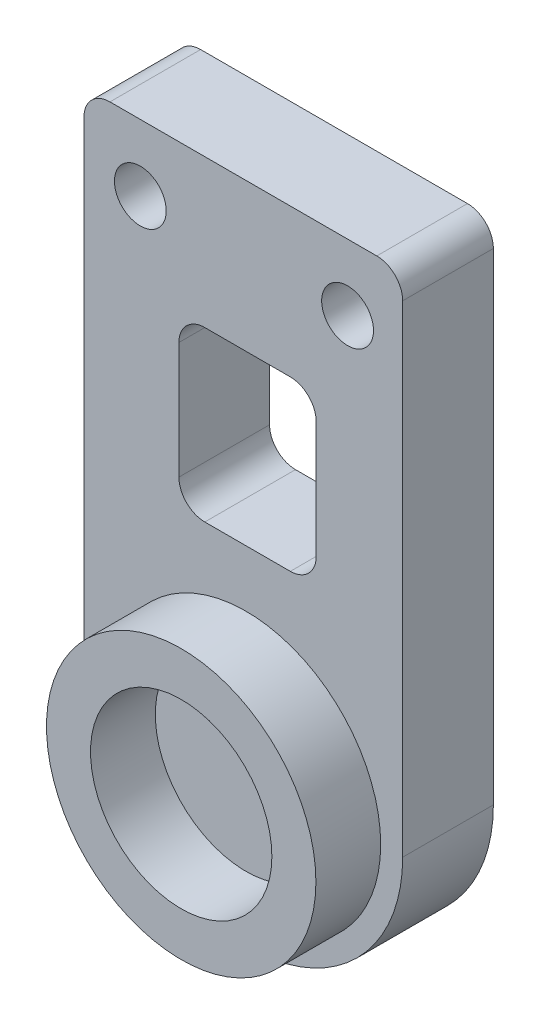
ISO-10303-21;
HEADER;
FILE_DESCRIPTION(('STEP AP214'),'2;1');
FILE_NAME('part.step','',(''),(''),'','','');
FILE_SCHEMA(('AUTOMOTIVE_DESIGN { 1 0 10303 214 1 1 1 1 }'));
ENDSEC;
DATA;
#1=APPLICATION_CONTEXT('core data for automotive mechanical design processes');
#2=APPLICATION_PROTOCOL_DEFINITION('international standard','automotive_design',2000,#1);
#3=PRODUCT_CONTEXT('',#1,'mechanical');
#4=PRODUCT('Part','Part','',(#3));
#5=PRODUCT_RELATED_PRODUCT_CATEGORY('part','',(#4));
#6=PRODUCT_DEFINITION_FORMATION('','',#4);
#7=PRODUCT_DEFINITION_CONTEXT('part definition',#1,'design');
#8=PRODUCT_DEFINITION('design','',#6,#7);
#9=PRODUCT_DEFINITION_SHAPE('','',#8);
#10=(LENGTH_UNIT() NAMED_UNIT(*) SI_UNIT(.MILLI.,.METRE.));
#11=(NAMED_UNIT(*) PLANE_ANGLE_UNIT() SI_UNIT($,.RADIAN.));
#12=(NAMED_UNIT(*) SI_UNIT($,.STERADIAN.) SOLID_ANGLE_UNIT());
#13=UNCERTAINTY_MEASURE_WITH_UNIT(LENGTH_MEASURE(1.E-05),#10,'distance_accuracy_value','');
#14=(GEOMETRIC_REPRESENTATION_CONTEXT(3) GLOBAL_UNCERTAINTY_ASSIGNED_CONTEXT((#13)) GLOBAL_UNIT_ASSIGNED_CONTEXT((#10,
#11,#12)) REPRESENTATION_CONTEXT('',''));
#15=CARTESIAN_POINT('',(0.,0.,0.));
#16=DIRECTION('',(0.,0.,1.));
#17=DIRECTION('',(1.,0.,0.));
#18=AXIS2_PLACEMENT_3D('',#15,#16,#17);
#19=CARTESIAN_POINT('',(-301.254618969033,240.505749953129,11.5));
#20=DIRECTION('',(1.,0.,0.));
#21=DIRECTION('',(0.,0.,-1.));
#22=AXIS2_PLACEMENT_3D('',#19,#20,#21);
#23=PLANE('',#22);
#24=DIRECTION('',(0.,-1.,0.));
#25=VECTOR('',#24,1.);
#26=CARTESIAN_POINT('',(-301.254618969033,240.505749953129,8.));
#27=LINE('',#26,#25);
#28=CARTESIAN_POINT('',(-301.254618969033,239.505749953129,8.));
#29=VERTEX_POINT('',#28);
#30=CARTESIAN_POINT('',(-301.254618969033,220.905749953129,8.));
#31=VERTEX_POINT('',#30);
#32=EDGE_CURVE('E214',#29,#31,#27,.T.);
#33=ORIENTED_EDGE('',*,*,#32,.T.);
#34=DIRECTION('',(0.,0.,-1.));
#35=VECTOR('',#34,1.);
#36=CARTESIAN_POINT('',(-301.254618969033,220.905749953129,11.5));
#37=LINE('',#36,#35);
#38=CARTESIAN_POINT('',(-301.254618969033,220.905749953129,11.5));
#39=VERTEX_POINT('',#38);
#40=EDGE_CURVE('E48',#31,#39,#37,.F.);
#41=ORIENTED_EDGE('',*,*,#40,.T.);
#42=DIRECTION('',(0.,-1.,0.));
#43=VECTOR('',#42,1.);
#44=CARTESIAN_POINT('',(-301.254618969033,240.505749953129,11.5));
#45=LINE('',#44,#43);
#46=CARTESIAN_POINT('',(-301.254618969033,239.505749953129,11.5));
#47=VERTEX_POINT('',#46);
#48=EDGE_CURVE('E200',#47,#39,#45,.T.);
#49=ORIENTED_EDGE('',*,*,#48,.F.);
#50=DIRECTION('',(0.,0.,-1.));
#51=VECTOR('',#50,1.);
#52=CARTESIAN_POINT('',(-301.254618969033,239.505749953129,11.5));
#53=LINE('',#52,#51);
#54=EDGE_CURVE('E248',#47,#29,#53,.T.);
#55=ORIENTED_EDGE('',*,*,#54,.T.);
#56=EDGE_LOOP('',(#33,#41,#49,#55));
#57=FACE_BOUND('',#56,.T.);
#58=ADVANCED_FACE('F39',(#57),#23,.F.);
#59=CARTESIAN_POINT('',(-301.254618969033,214.905749953129,11.5));
#60=DIRECTION('',(0.,1.,0.));
#61=DIRECTION('',(0.,0.,1.));
#62=AXIS2_PLACEMENT_3D('',#59,#60,#61);
#63=PLANE('',#62);
#64=DIRECTION('',(1.,0.,0.));
#65=VECTOR('',#64,1.);
#66=CARTESIAN_POINT('',(-301.254618969033,214.905749953129,8.));
#67=LINE('',#66,#65);
#68=CARTESIAN_POINT('',(-295.254618969033,214.905749953129,8.));
#69=VERTEX_POINT('',#68);
#70=CARTESIAN_POINT('',(-294.954618969033,214.905749953129,8.));
#71=VERTEX_POINT('',#70);
#72=EDGE_CURVE('E217',#69,#71,#67,.T.);
#73=ORIENTED_EDGE('',*,*,#72,.T.);
#74=DIRECTION('',(0.,0.,-1.));
#75=VECTOR('',#74,1.);
#76=CARTESIAN_POINT('',(-294.954618969033,214.905749953129,11.5));
#77=LINE('',#76,#75);
#78=CARTESIAN_POINT('',(-294.954618969033,214.905749953129,11.5));
#79=VERTEX_POINT('',#78);
#80=EDGE_CURVE('E62',#71,#79,#77,.F.);
#81=ORIENTED_EDGE('',*,*,#80,.T.);
#82=DIRECTION('',(1.,0.,0.));
#83=VECTOR('',#82,1.);
#84=CARTESIAN_POINT('',(-301.254618969033,214.905749953129,11.5));
#85=LINE('',#84,#83);
#86=CARTESIAN_POINT('',(-295.254618969033,214.905749953129,11.5));
#87=VERTEX_POINT('',#86);
#88=EDGE_CURVE('E203',#87,#79,#85,.T.);
#89=ORIENTED_EDGE('',*,*,#88,.F.);
#90=DIRECTION('',(0.,0.,-1.));
#91=VECTOR('',#90,1.);
#92=CARTESIAN_POINT('',(-295.254618969033,214.905749953129,11.5));
#93=LINE('',#92,#91);
#94=EDGE_CURVE('E304',#87,#69,#93,.T.);
#95=ORIENTED_EDGE('',*,*,#94,.T.);
#96=EDGE_LOOP('',(#73,#81,#89,#95));
#97=FACE_BOUND('',#96,.T.);
#98=ADVANCED_FACE('F384',(#97),#63,.F.);
#99=CARTESIAN_POINT('',(-288.954618969033,240.505749953129,11.5));
#100=DIRECTION('',(-1.,0.,0.));
#101=DIRECTION('',(0.,-1.,0.));
#102=AXIS2_PLACEMENT_3D('',#99,#100,#101);
#103=PLANE('',#102);
#104=DIRECTION('',(0.,1.,0.));
#105=VECTOR('',#104,1.);
#106=CARTESIAN_POINT('',(-288.954618969033,240.505749953129,11.5));
#107=LINE('',#106,#105);
#108=CARTESIAN_POINT('',(-288.954618969033,220.905749953129,11.5));
#109=VERTEX_POINT('',#108);
#110=CARTESIAN_POINT('',(-288.954618969033,239.505749953129,11.5));
#111=VERTEX_POINT('',#110);
#112=EDGE_CURVE('E207',#109,#111,#107,.T.);
#113=ORIENTED_EDGE('',*,*,#112,.F.);
#114=DIRECTION('',(0.,0.,-1.));
#115=VECTOR('',#114,1.);
#116=CARTESIAN_POINT('',(-288.954618969033,220.905749953129,11.5));
#117=LINE('',#116,#115);
#118=CARTESIAN_POINT('',(-288.954618969033,220.905749953129,8.));
#119=VERTEX_POINT('',#118);
#120=EDGE_CURVE('E294',#109,#119,#117,.T.);
#121=ORIENTED_EDGE('',*,*,#120,.T.);
#122=DIRECTION('',(0.,1.,0.));
#123=VECTOR('',#122,1.);
#124=CARTESIAN_POINT('',(-288.954618969033,240.505749953129,8.));
#125=LINE('',#124,#123);
#126=CARTESIAN_POINT('',(-288.954618969033,239.505749953129,8.));
#127=VERTEX_POINT('',#126);
#128=EDGE_CURVE('E221',#119,#127,#125,.T.);
#129=ORIENTED_EDGE('',*,*,#128,.T.);
#130=DIRECTION('',(0.,0.,-1.));
#131=VECTOR('',#130,1.);
#132=CARTESIAN_POINT('',(-288.954618969033,239.505749953129,11.5));
#133=LINE('',#132,#131);
#134=EDGE_CURVE('E168',#127,#111,#133,.F.);
#135=ORIENTED_EDGE('',*,*,#134,.T.);
#136=EDGE_LOOP('',(#113,#121,#129,#135));
#137=FACE_BOUND('',#136,.T.);
#138=ADVANCED_FACE('F389',(#137),#103,.F.);
#139=CARTESIAN_POINT('',(-301.254618969033,240.505749953129,11.5));
#140=DIRECTION('',(0.,-1.,0.));
#141=DIRECTION('',(0.,0.,-1.));
#142=AXIS2_PLACEMENT_3D('',#139,#140,#141);
#143=PLANE('',#142);
#144=DIRECTION('',(-1.,0.,0.));
#145=VECTOR('',#144,1.);
#146=CARTESIAN_POINT('',(-301.254618969033,240.505749953129,8.));
#147=LINE('',#146,#145);
#148=CARTESIAN_POINT('',(-289.954618969033,240.505749953129,8.));
#149=VERTEX_POINT('',#148);
#150=CARTESIAN_POINT('',(-300.254618969033,240.505749953129,8.));
#151=VERTEX_POINT('',#150);
#152=EDGE_CURVE('E204',#149,#151,#147,.T.);
#153=ORIENTED_EDGE('',*,*,#152,.T.);
#154=DIRECTION('',(0.,0.,-1.));
#155=VECTOR('',#154,1.);
#156=CARTESIAN_POINT('',(-300.254618969033,240.505749953129,11.5));
#157=LINE('',#156,#155);
#158=CARTESIAN_POINT('',(-300.254618969033,240.505749953129,11.5));
#159=VERTEX_POINT('',#158);
#160=EDGE_CURVE('E263',#151,#159,#157,.F.);
#161=ORIENTED_EDGE('',*,*,#160,.T.);
#162=DIRECTION('',(-1.,0.,0.));
#163=VECTOR('',#162,1.);
#164=CARTESIAN_POINT('',(-301.254618969033,240.505749953129,11.5));
#165=LINE('',#164,#163);
#166=CARTESIAN_POINT('',(-289.954618969033,240.505749953129,11.5));
#167=VERTEX_POINT('',#166);
#168=EDGE_CURVE('E210',#167,#159,#165,.T.);
#169=ORIENTED_EDGE('',*,*,#168,.F.);
#170=DIRECTION('',(0.,0.,-1.));
#171=VECTOR('',#170,1.);
#172=CARTESIAN_POINT('',(-289.954618969033,240.505749953129,11.5));
#173=LINE('',#172,#171);
#174=EDGE_CURVE('E259',#167,#149,#173,.T.);
#175=ORIENTED_EDGE('',*,*,#174,.T.);
#176=EDGE_LOOP('',(#153,#161,#169,#175));
#177=FACE_BOUND('',#176,.T.);
#178=ADVANCED_FACE('F430',(#177),#143,.F.);
#179=CARTESIAN_POINT('',(0.,0.,11.5));
#180=DIRECTION('',(0.,0.,1.));
#181=DIRECTION('',(1.,0.,0.));
#182=AXIS2_PLACEMENT_3D('',#179,#180,#181);
#183=PLANE('',#182);
#184=CARTESIAN_POINT('',(-295.004474020561,220.905749953129,11.5));
#185=DIRECTION('',(0.,0.,1.));
#186=DIRECTION('',(1.,0.,0.));
#187=AXIS2_PLACEMENT_3D('',#184,#185,#186);
#188=CIRCLE('',#187,5.19999999999997);
#189=CARTESIAN_POINT('',(-289.804474020561,220.905749953129,11.5));
#190=VERTEX_POINT('',#189);
#191=EDGE_CURVE('E354',#190,#190,#188,.T.);
#192=ORIENTED_EDGE('',*,*,#191,.F.);
#193=EDGE_LOOP('',(#192));
#194=FACE_BOUND('',#193,.T.);
#195=CARTESIAN_POINT('',(-299.082028178935,237.944260963885,11.5));
#196=DIRECTION('',(0.,0.,1.));
#197=DIRECTION('',(1.,0.,0.));
#198=AXIS2_PLACEMENT_3D('',#195,#196,#197);
#199=CIRCLE('',#198,0.999999999999998);
#200=CARTESIAN_POINT('',(-298.082028178935,237.944260963885,11.5));
#201=VERTEX_POINT('',#200);
#202=EDGE_CURVE('E319',#201,#201,#199,.T.);
#203=ORIENTED_EDGE('',*,*,#202,.F.);
#204=EDGE_LOOP('',(#203));
#205=FACE_BOUND('',#204,.T.);
#206=CARTESIAN_POINT('',(-291.082028178935,237.944260963885,11.5));
#207=DIRECTION('',(0.,0.,1.));
#208=DIRECTION('',(1.,0.,0.));
#209=AXIS2_PLACEMENT_3D('',#206,#207,#208);
#210=CIRCLE('',#209,0.999999999999998);
#211=CARTESIAN_POINT('',(-290.082028178935,237.944260963885,11.5));
#212=VERTEX_POINT('',#211);
#213=EDGE_CURVE('E327',#212,#212,#210,.T.);
#214=ORIENTED_EDGE('',*,*,#213,.F.);
#215=EDGE_LOOP('',(#214));
#216=FACE_BOUND('',#215,.T.);
#217=DIRECTION('',(0.,-1.,0.));
#218=VECTOR('',#217,1.);
#219=CARTESIAN_POINT('',(-297.592907714844,234.792892456055,11.5));
#220=LINE('',#219,#218);
#221=CARTESIAN_POINT('',(-297.592907714844,233.792892456055,11.5));
#222=VERTEX_POINT('',#221);
#223=CARTESIAN_POINT('',(-297.592907714844,229.292892456055,11.5));
#224=VERTEX_POINT('',#223);
#225=EDGE_CURVE('E196',#222,#224,#220,.T.);
#226=ORIENTED_EDGE('',*,*,#225,.F.);
#227=CARTESIAN_POINT('',(-296.592907714844,233.792892456055,11.5));
#228=DIRECTION('',(0.,0.,1.));
#229=DIRECTION('',(1.,0.,0.));
#230=AXIS2_PLACEMENT_3D('',#227,#228,#229);
#231=CIRCLE('',#230,1.);
#232=CARTESIAN_POINT('',(-296.592907714844,234.792892456055,11.5));
#233=VERTEX_POINT('',#232);
#234=EDGE_CURVE('E283',#222,#233,#231,.F.);
#235=ORIENTED_EDGE('',*,*,#234,.T.);
#236=DIRECTION('',(-1.,0.,0.));
#237=VECTOR('',#236,1.);
#238=CARTESIAN_POINT('',(-297.592907714844,234.792892456055,11.5));
#239=LINE('',#238,#237);
#240=CARTESIAN_POINT('',(-293.292907714844,234.792892456055,11.5));
#241=VERTEX_POINT('',#240);
#242=EDGE_CURVE('E188',#241,#233,#239,.T.);
#243=ORIENTED_EDGE('',*,*,#242,.F.);
#244=CARTESIAN_POINT('',(-293.292907714844,233.792892456055,11.5));
#245=DIRECTION('',(0.,0.,1.));
#246=DIRECTION('',(1.,0.,0.));
#247=AXIS2_PLACEMENT_3D('',#244,#245,#246);
#248=CIRCLE('',#247,1.);
#249=CARTESIAN_POINT('',(-292.292907714844,233.792892456055,11.5));
#250=VERTEX_POINT('',#249);
#251=EDGE_CURVE('E186',#241,#250,#248,.F.);
#252=ORIENTED_EDGE('',*,*,#251,.T.);
#253=DIRECTION('',(0.,1.,0.));
#254=VECTOR('',#253,1.);
#255=CARTESIAN_POINT('',(-292.292907714844,234.792892456055,11.5));
#256=LINE('',#255,#254);
#257=CARTESIAN_POINT('',(-292.292907714844,229.292892456055,11.5));
#258=VERTEX_POINT('',#257);
#259=EDGE_CURVE('E174',#258,#250,#256,.T.);
#260=ORIENTED_EDGE('',*,*,#259,.F.);
#261=CARTESIAN_POINT('',(-293.292907714844,229.292892456055,11.5));
#262=DIRECTION('',(0.,0.,1.));
#263=DIRECTION('',(1.,0.,0.));
#264=AXIS2_PLACEMENT_3D('',#261,#262,#263);
#265=CIRCLE('',#264,1.);
#266=CARTESIAN_POINT('',(-293.292907714844,228.292892456055,11.5));
#267=VERTEX_POINT('',#266);
#268=EDGE_CURVE('E156',#258,#267,#265,.F.);
#269=ORIENTED_EDGE('',*,*,#268,.T.);
#270=DIRECTION('',(1.,0.,0.));
#271=VECTOR('',#270,1.);
#272=CARTESIAN_POINT('',(-297.592907714844,228.292892456055,11.5));
#273=LINE('',#272,#271);
#274=CARTESIAN_POINT('',(-296.592907714844,228.292892456055,11.5));
#275=VERTEX_POINT('',#274);
#276=EDGE_CURVE('E189',#275,#267,#273,.T.);
#277=ORIENTED_EDGE('',*,*,#276,.F.);
#278=CARTESIAN_POINT('',(-296.592907714844,229.292892456055,11.5));
#279=DIRECTION('',(0.,0.,1.));
#280=DIRECTION('',(1.,0.,0.));
#281=AXIS2_PLACEMENT_3D('',#278,#279,#280);
#282=CIRCLE('',#281,1.);
#283=EDGE_CURVE('E277',#275,#224,#282,.F.);
#284=ORIENTED_EDGE('',*,*,#283,.T.);
#285=EDGE_LOOP('',(#226,#235,#243,#252,#260,#269,#277,#284));
#286=FACE_BOUND('',#285,.T.);
#287=ORIENTED_EDGE('',*,*,#88,.T.);
#288=CARTESIAN_POINT('',(-294.954618969033,220.905749953129,11.5));
#289=DIRECTION('',(0.,0.,1.));
#290=DIRECTION('',(1.,0.,0.));
#291=AXIS2_PLACEMENT_3D('',#288,#289,#290);
#292=CIRCLE('',#291,6.);
#293=EDGE_CURVE('E313',#79,#109,#292,.T.);
#294=ORIENTED_EDGE('',*,*,#293,.T.);
#295=ORIENTED_EDGE('',*,*,#112,.T.);
#296=CARTESIAN_POINT('',(-289.954618969033,239.505749953129,11.5));
#297=DIRECTION('',(0.,0.,1.));
#298=DIRECTION('',(1.,0.,0.));
#299=AXIS2_PLACEMENT_3D('',#296,#297,#298);
#300=CIRCLE('',#299,1.);
#301=EDGE_CURVE('E266',#111,#167,#300,.T.);
#302=ORIENTED_EDGE('',*,*,#301,.T.);
#303=ORIENTED_EDGE('',*,*,#168,.T.);
#304=CARTESIAN_POINT('',(-300.254618969033,239.505749953129,11.5));
#305=DIRECTION('',(0.,0.,1.));
#306=DIRECTION('',(1.,0.,0.));
#307=AXIS2_PLACEMENT_3D('',#304,#305,#306);
#308=CIRCLE('',#307,1.);
#309=EDGE_CURVE('E269',#159,#47,#308,.T.);
#310=ORIENTED_EDGE('',*,*,#309,.T.);
#311=ORIENTED_EDGE('',*,*,#48,.T.);
#312=CARTESIAN_POINT('',(-295.254618969033,220.905749953129,11.5));
#313=DIRECTION('',(0.,0.,1.));
#314=DIRECTION('',(1.,0.,0.));
#315=AXIS2_PLACEMENT_3D('',#312,#313,#314);
#316=CIRCLE('',#315,6.);
#317=EDGE_CURVE('E310',#39,#87,#316,.T.);
#318=ORIENTED_EDGE('',*,*,#317,.T.);
#319=EDGE_LOOP('',(#287,#294,#295,#302,#303,#310,#311,#318));
#320=FACE_BOUND('',#319,.T.);
#321=ADVANCED_FACE('F183',(#194,#205,#216,#286,#320),#183,.T.);
#322=CARTESIAN_POINT('',(0.,0.,8.));
#323=DIRECTION('',(0.,0.,1.));
#324=DIRECTION('',(1.,0.,0.));
#325=AXIS2_PLACEMENT_3D('',#322,#323,#324);
#326=PLANE('',#325);
#327=CARTESIAN_POINT('',(-299.082028178935,237.944260963885,8.));
#328=DIRECTION('',(0.,0.,1.));
#329=DIRECTION('',(1.,0.,0.));
#330=AXIS2_PLACEMENT_3D('',#327,#328,#329);
#331=CIRCLE('',#330,0.999999999999998);
#332=CARTESIAN_POINT('',(-298.082028178935,237.944260963885,8.));
#333=VERTEX_POINT('',#332);
#334=EDGE_CURVE('E218',#333,#333,#331,.T.);
#335=ORIENTED_EDGE('',*,*,#334,.T.);
#336=EDGE_LOOP('',(#335));
#337=FACE_BOUND('',#336,.T.);
#338=CARTESIAN_POINT('',(-291.082028178935,237.944260963885,8.));
#339=DIRECTION('',(0.,0.,1.));
#340=DIRECTION('',(1.,0.,0.));
#341=AXIS2_PLACEMENT_3D('',#338,#339,#340);
#342=CIRCLE('',#341,0.999999999999998);
#343=CARTESIAN_POINT('',(-290.082028178935,237.944260963885,8.));
#344=VERTEX_POINT('',#343);
#345=EDGE_CURVE('E323',#344,#344,#342,.T.);
#346=ORIENTED_EDGE('',*,*,#345,.T.);
#347=EDGE_LOOP('',(#346));
#348=FACE_BOUND('',#347,.T.);
#349=DIRECTION('',(0.,1.,0.));
#350=VECTOR('',#349,1.);
#351=CARTESIAN_POINT('',(-292.292907714844,234.792892456055,8.));
#352=LINE('',#351,#350);
#353=CARTESIAN_POINT('',(-292.292907714844,229.292892456055,8.));
#354=VERTEX_POINT('',#353);
#355=CARTESIAN_POINT('',(-292.292907714844,233.792892456055,8.));
#356=VERTEX_POINT('',#355);
#357=EDGE_CURVE('E177',#354,#356,#352,.T.);
#358=ORIENTED_EDGE('',*,*,#357,.T.);
#359=CARTESIAN_POINT('',(-293.292907714844,233.792892456055,8.));
#360=DIRECTION('',(0.,0.,1.));
#361=DIRECTION('',(1.,0.,0.));
#362=AXIS2_PLACEMENT_3D('',#359,#360,#361);
#363=CIRCLE('',#362,1.);
#364=CARTESIAN_POINT('',(-293.292907714844,234.792892456055,8.));
#365=VERTEX_POINT('',#364);
#366=EDGE_CURVE('E291',#356,#365,#363,.T.);
#367=ORIENTED_EDGE('',*,*,#366,.T.);
#368=DIRECTION('',(-1.,0.,0.));
#369=VECTOR('',#368,1.);
#370=CARTESIAN_POINT('',(-297.592907714844,234.792892456055,8.));
#371=LINE('',#370,#369);
#372=CARTESIAN_POINT('',(-296.592907714844,234.792892456055,8.));
#373=VERTEX_POINT('',#372);
#374=EDGE_CURVE('E331',#365,#373,#371,.T.);
#375=ORIENTED_EDGE('',*,*,#374,.T.);
#376=CARTESIAN_POINT('',(-296.592907714844,233.792892456055,8.));
#377=DIRECTION('',(0.,0.,1.));
#378=DIRECTION('',(1.,0.,0.));
#379=AXIS2_PLACEMENT_3D('',#376,#377,#378);
#380=CIRCLE('',#379,1.);
#381=CARTESIAN_POINT('',(-297.592907714844,233.792892456055,8.));
#382=VERTEX_POINT('',#381);
#383=EDGE_CURVE('E286',#373,#382,#380,.T.);
#384=ORIENTED_EDGE('',*,*,#383,.T.);
#385=DIRECTION('',(0.,-1.,0.));
#386=VECTOR('',#385,1.);
#387=CARTESIAN_POINT('',(-297.592907714844,234.792892456055,8.));
#388=LINE('',#387,#386);
#389=CARTESIAN_POINT('',(-297.592907714844,229.292892456055,8.));
#390=VERTEX_POINT('',#389);
#391=EDGE_CURVE('E194',#382,#390,#388,.T.);
#392=ORIENTED_EDGE('',*,*,#391,.T.);
#393=CARTESIAN_POINT('',(-296.592907714844,229.292892456055,8.));
#394=DIRECTION('',(0.,0.,1.));
#395=DIRECTION('',(1.,0.,0.));
#396=AXIS2_PLACEMENT_3D('',#393,#394,#395);
#397=CIRCLE('',#396,1.);
#398=CARTESIAN_POINT('',(-296.592907714844,228.292892456055,8.));
#399=VERTEX_POINT('',#398);
#400=EDGE_CURVE('E280',#390,#399,#397,.T.);
#401=ORIENTED_EDGE('',*,*,#400,.T.);
#402=DIRECTION('',(1.,0.,0.));
#403=VECTOR('',#402,1.);
#404=CARTESIAN_POINT('',(-297.592907714844,228.292892456055,8.));
#405=LINE('',#404,#403);
#406=CARTESIAN_POINT('',(-293.292907714844,228.292892456055,8.));
#407=VERTEX_POINT('',#406);
#408=EDGE_CURVE('E337',#399,#407,#405,.T.);
#409=ORIENTED_EDGE('',*,*,#408,.T.);
#410=CARTESIAN_POINT('',(-293.292907714844,229.292892456055,8.));
#411=DIRECTION('',(0.,0.,1.));
#412=DIRECTION('',(1.,0.,0.));
#413=AXIS2_PLACEMENT_3D('',#410,#411,#412);
#414=CIRCLE('',#413,1.);
#415=EDGE_CURVE('E167',#407,#354,#414,.T.);
#416=ORIENTED_EDGE('',*,*,#415,.T.);
#417=EDGE_LOOP('',(#358,#367,#375,#384,#392,#401,#409,#416));
#418=FACE_BOUND('',#417,.T.);
#419=ORIENTED_EDGE('',*,*,#128,.F.);
#420=CARTESIAN_POINT('',(-294.954618969033,220.905749953129,8.));
#421=DIRECTION('',(0.,0.,1.));
#422=DIRECTION('',(1.,0.,0.));
#423=AXIS2_PLACEMENT_3D('',#420,#421,#422);
#424=CIRCLE('',#423,6.);
#425=EDGE_CURVE('E301',#119,#71,#424,.F.);
#426=ORIENTED_EDGE('',*,*,#425,.T.);
#427=ORIENTED_EDGE('',*,*,#72,.F.);
#428=CARTESIAN_POINT('',(-295.254618969033,220.905749953129,8.));
#429=DIRECTION('',(0.,0.,1.));
#430=DIRECTION('',(1.,0.,0.));
#431=AXIS2_PLACEMENT_3D('',#428,#429,#430);
#432=CIRCLE('',#431,6.);
#433=EDGE_CURVE('E298',#69,#31,#432,.F.);
#434=ORIENTED_EDGE('',*,*,#433,.T.);
#435=ORIENTED_EDGE('',*,*,#32,.F.);
#436=CARTESIAN_POINT('',(-300.254618969033,239.505749953129,8.));
#437=DIRECTION('',(0.,0.,1.));
#438=DIRECTION('',(1.,0.,0.));
#439=AXIS2_PLACEMENT_3D('',#436,#437,#438);
#440=CIRCLE('',#439,1.);
#441=EDGE_CURVE('E256',#29,#151,#440,.F.);
#442=ORIENTED_EDGE('',*,*,#441,.T.);
#443=ORIENTED_EDGE('',*,*,#152,.F.);
#444=CARTESIAN_POINT('',(-289.954618969033,239.505749953129,8.));
#445=DIRECTION('',(0.,0.,1.));
#446=DIRECTION('',(1.,0.,0.));
#447=AXIS2_PLACEMENT_3D('',#444,#445,#446);
#448=CIRCLE('',#447,1.);
#449=EDGE_CURVE('E252',#149,#127,#448,.F.);
#450=ORIENTED_EDGE('',*,*,#449,.T.);
#451=EDGE_LOOP('',(#419,#426,#427,#434,#435,#442,#443,#450));
#452=FACE_BOUND('',#451,.T.);
#453=ADVANCED_FACE('F437',(#337,#348,#418,#452),#326,.F.);
#454=CARTESIAN_POINT('',(-297.592907714844,234.792892456055,8.));
#455=DIRECTION('',(-1.,0.,0.));
#456=DIRECTION('',(0.,0.,1.));
#457=AXIS2_PLACEMENT_3D('',#454,#455,#456);
#458=PLANE('',#457);
#459=ORIENTED_EDGE('',*,*,#225,.T.);
#460=DIRECTION('',(0.,0.,1.));
#461=VECTOR('',#460,1.);
#462=CARTESIAN_POINT('',(-297.592907714844,229.292892456055,8.));
#463=LINE('',#462,#461);
#464=EDGE_CURVE('E238',#224,#390,#463,.F.);
#465=ORIENTED_EDGE('',*,*,#464,.T.);
#466=ORIENTED_EDGE('',*,*,#391,.F.);
#467=DIRECTION('',(0.,0.,1.));
#468=VECTOR('',#467,1.);
#469=CARTESIAN_POINT('',(-297.592907714844,233.792892456055,11.5));
#470=LINE('',#469,#468);
#471=EDGE_CURVE('E234',#382,#222,#470,.T.);
#472=ORIENTED_EDGE('',*,*,#471,.T.);
#473=EDGE_LOOP('',(#459,#465,#466,#472));
#474=FACE_BOUND('',#473,.T.);
#475=ADVANCED_FACE('F441',(#474),#458,.F.);
#476=CARTESIAN_POINT('',(-297.592907714844,234.792892456055,8.));
#477=DIRECTION('',(0.,1.,0.));
#478=DIRECTION('',(0.,0.,1.));
#479=AXIS2_PLACEMENT_3D('',#476,#477,#478);
#480=PLANE('',#479);
#481=ORIENTED_EDGE('',*,*,#242,.T.);
#482=DIRECTION('',(0.,0.,1.));
#483=VECTOR('',#482,1.);
#484=CARTESIAN_POINT('',(-296.592907714844,234.792892456055,8.));
#485=LINE('',#484,#483);
#486=EDGE_CURVE('E245',#233,#373,#485,.F.);
#487=ORIENTED_EDGE('',*,*,#486,.T.);
#488=ORIENTED_EDGE('',*,*,#374,.F.);
#489=DIRECTION('',(0.,0.,1.));
#490=VECTOR('',#489,1.);
#491=CARTESIAN_POINT('',(-293.292907714844,234.792892456055,11.5));
#492=LINE('',#491,#490);
#493=EDGE_CURVE('E241',#365,#241,#492,.T.);
#494=ORIENTED_EDGE('',*,*,#493,.T.);
#495=EDGE_LOOP('',(#481,#487,#488,#494));
#496=FACE_BOUND('',#495,.T.);
#497=ADVANCED_FACE('F448',(#496),#480,.F.);
#498=CARTESIAN_POINT('',(-292.292907714844,234.792892456055,8.));
#499=DIRECTION('',(1.,0.,0.));
#500=DIRECTION('',(0.,0.,-1.));
#501=AXIS2_PLACEMENT_3D('',#498,#499,#500);
#502=PLANE('',#501);
#503=ORIENTED_EDGE('',*,*,#357,.F.);
#504=DIRECTION('',(0.,0.,1.));
#505=VECTOR('',#504,1.);
#506=CARTESIAN_POINT('',(-292.292907714844,229.292892456055,11.5));
#507=LINE('',#506,#505);
#508=EDGE_CURVE('E160',#354,#258,#507,.T.);
#509=ORIENTED_EDGE('',*,*,#508,.T.);
#510=ORIENTED_EDGE('',*,*,#259,.T.);
#511=DIRECTION('',(0.,0.,1.));
#512=VECTOR('',#511,1.);
#513=CARTESIAN_POINT('',(-292.292907714844,233.792892456055,8.));
#514=LINE('',#513,#512);
#515=EDGE_CURVE('E180',#250,#356,#514,.F.);
#516=ORIENTED_EDGE('',*,*,#515,.T.);
#517=EDGE_LOOP('',(#503,#509,#510,#516));
#518=FACE_BOUND('',#517,.T.);
#519=ADVANCED_FACE('F173',(#518),#502,.F.);
#520=CARTESIAN_POINT('',(-297.592907714844,228.292892456055,8.));
#521=DIRECTION('',(0.,-1.,0.));
#522=DIRECTION('',(0.,0.,-1.));
#523=AXIS2_PLACEMENT_3D('',#520,#521,#522);
#524=PLANE('',#523);
#525=ORIENTED_EDGE('',*,*,#276,.T.);
#526=DIRECTION('',(0.,0.,1.));
#527=VECTOR('',#526,1.);
#528=CARTESIAN_POINT('',(-293.292907714844,228.292892456055,8.));
#529=LINE('',#528,#527);
#530=EDGE_CURVE('E161',#267,#407,#529,.F.);
#531=ORIENTED_EDGE('',*,*,#530,.T.);
#532=ORIENTED_EDGE('',*,*,#408,.F.);
#533=DIRECTION('',(0.,0.,1.));
#534=VECTOR('',#533,1.);
#535=CARTESIAN_POINT('',(-296.592907714844,228.292892456055,11.5));
#536=LINE('',#535,#534);
#537=EDGE_CURVE('E179',#399,#275,#536,.T.);
#538=ORIENTED_EDGE('',*,*,#537,.T.);
#539=EDGE_LOOP('',(#525,#531,#532,#538));
#540=FACE_BOUND('',#539,.T.);
#541=ADVANCED_FACE('F555',(#540),#524,.F.);
#542=CARTESIAN_POINT('',(-291.082028178935,237.944260963885,8.));
#543=DIRECTION('',(0.,0.,1.));
#544=DIRECTION('',(1.,0.,0.));
#545=AXIS2_PLACEMENT_3D('',#542,#543,#544);
#546=CYLINDRICAL_SURFACE('',#545,0.999999999999998);
#547=ORIENTED_EDGE('',*,*,#345,.F.);
#548=EDGE_LOOP('',(#547));
#549=FACE_BOUND('',#548,.T.);
#550=ORIENTED_EDGE('',*,*,#213,.T.);
#551=EDGE_LOOP('',(#550));
#552=FACE_BOUND('',#551,.T.);
#553=ADVANCED_FACE('F546',(#549,#552),#546,.F.);
#554=CARTESIAN_POINT('',(-299.082028178935,237.944260963885,8.));
#555=DIRECTION('',(0.,0.,1.));
#556=DIRECTION('',(1.,0.,0.));
#557=AXIS2_PLACEMENT_3D('',#554,#555,#556);
#558=CYLINDRICAL_SURFACE('',#557,0.999999999999998);
#559=ORIENTED_EDGE('',*,*,#334,.F.);
#560=EDGE_LOOP('',(#559));
#561=FACE_BOUND('',#560,.T.);
#562=ORIENTED_EDGE('',*,*,#202,.T.);
#563=EDGE_LOOP('',(#562));
#564=FACE_BOUND('',#563,.T.);
#565=ADVANCED_FACE('F396',(#561,#564),#558,.F.);
#566=CARTESIAN_POINT('',(-293.292907714844,229.292892456055,8.));
#567=DIRECTION('',(0.,0.,-1.));
#568=DIRECTION('',(-1.,0.,0.));
#569=AXIS2_PLACEMENT_3D('',#566,#567,#568);
#570=CYLINDRICAL_SURFACE('',#569,1.);
#571=ORIENTED_EDGE('',*,*,#415,.F.);
#572=ORIENTED_EDGE('',*,*,#530,.F.);
#573=ORIENTED_EDGE('',*,*,#268,.F.);
#574=ORIENTED_EDGE('',*,*,#508,.F.);
#575=EDGE_LOOP('',(#571,#572,#573,#574));
#576=FACE_BOUND('',#575,.T.);
#577=ADVANCED_FACE('F159',(#576),#570,.F.);
#578=CARTESIAN_POINT('',(-296.592907714844,229.292892456055,8.));
#579=DIRECTION('',(0.,0.,-1.));
#580=DIRECTION('',(-1.,0.,0.));
#581=AXIS2_PLACEMENT_3D('',#578,#579,#580);
#582=CYLINDRICAL_SURFACE('',#581,1.);
#583=ORIENTED_EDGE('',*,*,#400,.F.);
#584=ORIENTED_EDGE('',*,*,#464,.F.);
#585=ORIENTED_EDGE('',*,*,#283,.F.);
#586=ORIENTED_EDGE('',*,*,#537,.F.);
#587=EDGE_LOOP('',(#583,#584,#585,#586));
#588=FACE_BOUND('',#587,.T.);
#589=ADVANCED_FACE('F395',(#588),#582,.F.);
#590=CARTESIAN_POINT('',(-296.592907714844,233.792892456055,8.));
#591=DIRECTION('',(0.,0.,-1.));
#592=DIRECTION('',(-1.,0.,0.));
#593=AXIS2_PLACEMENT_3D('',#590,#591,#592);
#594=CYLINDRICAL_SURFACE('',#593,1.);
#595=ORIENTED_EDGE('',*,*,#383,.F.);
#596=ORIENTED_EDGE('',*,*,#486,.F.);
#597=ORIENTED_EDGE('',*,*,#234,.F.);
#598=ORIENTED_EDGE('',*,*,#471,.F.);
#599=EDGE_LOOP('',(#595,#596,#597,#598));
#600=FACE_BOUND('',#599,.T.);
#601=ADVANCED_FACE('F399',(#600),#594,.F.);
#602=CARTESIAN_POINT('',(-293.292907714844,233.792892456055,8.));
#603=DIRECTION('',(0.,0.,-1.));
#604=DIRECTION('',(-1.,0.,0.));
#605=AXIS2_PLACEMENT_3D('',#602,#603,#604);
#606=CYLINDRICAL_SURFACE('',#605,1.);
#607=ORIENTED_EDGE('',*,*,#366,.F.);
#608=ORIENTED_EDGE('',*,*,#515,.F.);
#609=ORIENTED_EDGE('',*,*,#251,.F.);
#610=ORIENTED_EDGE('',*,*,#493,.F.);
#611=EDGE_LOOP('',(#607,#608,#609,#610));
#612=FACE_BOUND('',#611,.T.);
#613=ADVANCED_FACE('F403',(#612),#606,.F.);
#614=CARTESIAN_POINT('',(-300.254618969033,239.505749953129,11.5));
#615=DIRECTION('',(0.,0.,-1.));
#616=DIRECTION('',(-1.,0.,0.));
#617=AXIS2_PLACEMENT_3D('',#614,#615,#616);
#618=CYLINDRICAL_SURFACE('',#617,1.);
#619=ORIENTED_EDGE('',*,*,#309,.F.);
#620=ORIENTED_EDGE('',*,*,#160,.F.);
#621=ORIENTED_EDGE('',*,*,#441,.F.);
#622=ORIENTED_EDGE('',*,*,#54,.F.);
#623=EDGE_LOOP('',(#619,#620,#621,#622));
#624=FACE_BOUND('',#623,.T.);
#625=ADVANCED_FACE('F407',(#624),#618,.T.);
#626=CARTESIAN_POINT('',(-289.954618969033,239.505749953129,11.5));
#627=DIRECTION('',(0.,0.,-1.));
#628=DIRECTION('',(-1.,0.,0.));
#629=AXIS2_PLACEMENT_3D('',#626,#627,#628);
#630=CYLINDRICAL_SURFACE('',#629,1.);
#631=ORIENTED_EDGE('',*,*,#301,.F.);
#632=ORIENTED_EDGE('',*,*,#134,.F.);
#633=ORIENTED_EDGE('',*,*,#449,.F.);
#634=ORIENTED_EDGE('',*,*,#174,.F.);
#635=EDGE_LOOP('',(#631,#632,#633,#634));
#636=FACE_BOUND('',#635,.T.);
#637=ADVANCED_FACE('F411',(#636),#630,.T.);
#638=CARTESIAN_POINT('',(-294.954618969033,220.905749953129,11.5));
#639=DIRECTION('',(0.,0.,-1.));
#640=DIRECTION('',(-1.,0.,0.));
#641=AXIS2_PLACEMENT_3D('',#638,#639,#640);
#642=CYLINDRICAL_SURFACE('',#641,6.);
#643=ORIENTED_EDGE('',*,*,#293,.F.);
#644=ORIENTED_EDGE('',*,*,#80,.F.);
#645=ORIENTED_EDGE('',*,*,#425,.F.);
#646=ORIENTED_EDGE('',*,*,#120,.F.);
#647=EDGE_LOOP('',(#643,#644,#645,#646));
#648=FACE_BOUND('',#647,.T.);
#649=ADVANCED_FACE('F380',(#648),#642,.T.);
#650=CARTESIAN_POINT('',(-295.254618969033,220.905749953129,11.5));
#651=DIRECTION('',(0.,0.,-1.));
#652=DIRECTION('',(-1.,0.,0.));
#653=AXIS2_PLACEMENT_3D('',#650,#651,#652);
#654=CYLINDRICAL_SURFACE('',#653,6.);
#655=ORIENTED_EDGE('',*,*,#317,.F.);
#656=ORIENTED_EDGE('',*,*,#40,.F.);
#657=ORIENTED_EDGE('',*,*,#433,.F.);
#658=ORIENTED_EDGE('',*,*,#94,.F.);
#659=EDGE_LOOP('',(#655,#656,#657,#658));
#660=FACE_BOUND('',#659,.T.);
#661=ADVANCED_FACE('F41',(#660),#654,.T.);
#662=CARTESIAN_POINT('',(-295.004474020561,220.905749953129,14.));
#663=DIRECTION('',(0.,0.,1.));
#664=DIRECTION('',(1.,0.,0.));
#665=AXIS2_PLACEMENT_3D('',#662,#663,#664);
#666=PLANE('',#665);
#667=CARTESIAN_POINT('',(-295.004474020561,220.905749953129,14.));
#668=DIRECTION('',(0.,0.,1.));
#669=DIRECTION('',(1.,0.,0.));
#670=AXIS2_PLACEMENT_3D('',#667,#668,#669);
#671=CIRCLE('',#670,5.19999999999997);
#672=CARTESIAN_POINT('',(-289.804474020561,220.905749953129,14.));
#673=VERTEX_POINT('',#672);
#674=EDGE_CURVE('E349',#673,#673,#671,.T.);
#675=ORIENTED_EDGE('',*,*,#674,.T.);
#676=EDGE_LOOP('',(#675));
#677=FACE_BOUND('',#676,.T.);
#678=CARTESIAN_POINT('',(-295.004474020561,220.905749953129,14.));
#679=DIRECTION('',(0.,0.,1.));
#680=DIRECTION('',(1.,0.,0.));
#681=AXIS2_PLACEMENT_3D('',#678,#679,#680);
#682=CIRCLE('',#681,3.50000000000002);
#683=CARTESIAN_POINT('',(-291.504474020561,220.905749953129,14.));
#684=VERTEX_POINT('',#683);
#685=EDGE_CURVE('E360',#684,#684,#682,.T.);
#686=ORIENTED_EDGE('',*,*,#685,.F.);
#687=EDGE_LOOP('',(#686));
#688=FACE_BOUND('',#687,.T.);
#689=ADVANCED_FACE('F370',(#677,#688),#666,.T.);
#690=CARTESIAN_POINT('',(-295.004474020561,220.905749953129,14.));
#691=DIRECTION('',(0.,0.,-1.));
#692=DIRECTION('',(-1.,0.,0.));
#693=AXIS2_PLACEMENT_3D('',#690,#691,#692);
#694=CYLINDRICAL_SURFACE('',#693,5.19999999999997);
#695=ORIENTED_EDGE('',*,*,#674,.F.);
#696=EDGE_LOOP('',(#695));
#697=FACE_BOUND('',#696,.T.);
#698=ORIENTED_EDGE('',*,*,#191,.T.);
#699=EDGE_LOOP('',(#698));
#700=FACE_BOUND('',#699,.T.);
#701=ADVANCED_FACE('F372',(#697,#700),#694,.T.);
#702=CARTESIAN_POINT('',(-295.004474020561,220.905749953129,14.));
#703=DIRECTION('',(0.,0.,-1.));
#704=DIRECTION('',(-1.,0.,0.));
#705=AXIS2_PLACEMENT_3D('',#702,#703,#704);
#706=CYLINDRICAL_SURFACE('',#705,3.50000000000002);
#707=ORIENTED_EDGE('',*,*,#685,.T.);
#708=EDGE_LOOP('',(#707));
#709=FACE_BOUND('',#708,.T.);
#710=CARTESIAN_POINT('',(-295.004474020561,220.905749953129,11.5));
#711=DIRECTION('',(0.,0.,1.));
#712=DIRECTION('',(1.,0.,0.));
#713=AXIS2_PLACEMENT_3D('',#710,#711,#712);
#714=CIRCLE('',#713,3.50000000000002);
#715=CARTESIAN_POINT('',(-291.504474020561,220.905749953129,11.5));
#716=VERTEX_POINT('',#715);
#717=EDGE_CURVE('E11',#716,#716,#714,.F.);
#718=ORIENTED_EDGE('',*,*,#717,.T.);
#719=EDGE_LOOP('',(#718));
#720=FACE_BOUND('',#719,.T.);
#721=ADVANCED_FACE('F367',(#709,#720),#706,.F.);
#722=ORIENTED_EDGE('',*,*,#717,.F.);
#723=EDGE_LOOP('',(#722));
#724=FACE_BOUND('',#723,.T.);
#725=ADVANCED_FACE('F452',(#724),#183,.T.);
#726=CLOSED_SHELL('',(#58,#98,#138,#178,#321,#453,#475,#497,#519,#541,#553,#565,#577,#589,#601,
#613,#625,#637,#649,#661,#689,#701,#721,#725));
#727=MANIFOLD_SOLID_BREP('B2',#726);
#728=ADVANCED_BREP_SHAPE_REPRESENTATION('',(#18,#727),#14);
#729=SHAPE_DEFINITION_REPRESENTATION(#9,#728);
ENDSEC;
END-ISO-10303-21;
